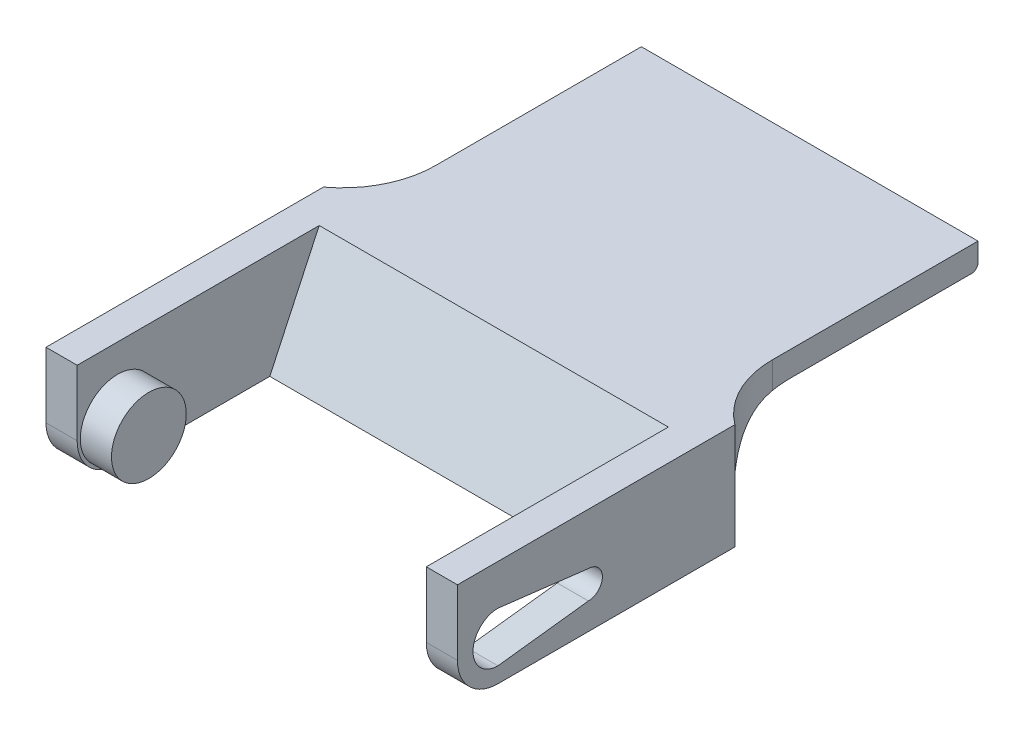
ISO-10303-21;
HEADER;
FILE_DESCRIPTION(('STEP AP214'),'2;1');
FILE_NAME('part.step','',(''),(''),'','','');
FILE_SCHEMA(('AUTOMOTIVE_DESIGN { 1 0 10303 214 1 1 1 1 }'));
ENDSEC;
DATA;
#1=APPLICATION_CONTEXT('core data for automotive mechanical design processes');
#2=APPLICATION_PROTOCOL_DEFINITION('international standard','automotive_design',2000,#1);
#3=PRODUCT_CONTEXT('',#1,'mechanical');
#4=PRODUCT('Part','Part','',(#3));
#5=PRODUCT_RELATED_PRODUCT_CATEGORY('part','',(#4));
#6=PRODUCT_DEFINITION_FORMATION('','',#4);
#7=PRODUCT_DEFINITION_CONTEXT('part definition',#1,'design');
#8=PRODUCT_DEFINITION('design','',#6,#7);
#9=PRODUCT_DEFINITION_SHAPE('','',#8);
#10=(LENGTH_UNIT() NAMED_UNIT(*) SI_UNIT(.MILLI.,.METRE.));
#11=(NAMED_UNIT(*) PLANE_ANGLE_UNIT() SI_UNIT($,.RADIAN.));
#12=(NAMED_UNIT(*) SI_UNIT($,.STERADIAN.) SOLID_ANGLE_UNIT());
#13=UNCERTAINTY_MEASURE_WITH_UNIT(LENGTH_MEASURE(1.E-05),#10,'distance_accuracy_value','');
#14=(GEOMETRIC_REPRESENTATION_CONTEXT(3) GLOBAL_UNCERTAINTY_ASSIGNED_CONTEXT((#13)) GLOBAL_UNIT_ASSIGNED_CONTEXT((#10,
#11,#12)) REPRESENTATION_CONTEXT('',''));
#15=CARTESIAN_POINT('',(0.,0.,0.));
#16=DIRECTION('',(0.,0.,1.));
#17=DIRECTION('',(1.,0.,0.));
#18=AXIS2_PLACEMENT_3D('',#15,#16,#17);
#19=CARTESIAN_POINT('',(-3.,-6.50000000000001,23.));
#20=DIRECTION('',(1.,0.,0.));
#21=DIRECTION('',(0.,0.,-1.));
#22=AXIS2_PLACEMENT_3D('',#19,#20,#21);
#23=CYLINDRICAL_SURFACE('',#22,6.);
#24=CARTESIAN_POINT('',(-1.,-6.50000000000001,23.));
#25=DIRECTION('',(-1.,0.,0.));
#26=DIRECTION('',(0.,0.,1.));
#27=AXIS2_PLACEMENT_3D('',#24,#25,#26);
#28=CIRCLE('',#27,6.);
#29=CARTESIAN_POINT('',(-1.,-6.50000000000001,29.));
#30=VERTEX_POINT('',#29);
#31=EDGE_CURVE('E383',#30,#30,#28,.T.);
#32=ORIENTED_EDGE('',*,*,#31,.F.);
#33=EDGE_LOOP('',(#32));
#34=FACE_BOUND('',#33,.T.);
#35=CARTESIAN_POINT('',(4.,-6.50000000000001,23.));
#36=DIRECTION('',(1.,0.,0.));
#37=DIRECTION('',(0.,0.,-1.));
#38=AXIS2_PLACEMENT_3D('',#35,#36,#37);
#39=CIRCLE('',#38,6.);
#40=CARTESIAN_POINT('',(4.,-6.50000000000001,17.));
#41=VERTEX_POINT('',#40);
#42=EDGE_CURVE('E387',#41,#41,#39,.T.);
#43=ORIENTED_EDGE('',*,*,#42,.F.);
#44=EDGE_LOOP('',(#43));
#45=FACE_BOUND('',#44,.T.);
#46=ADVANCED_FACE('F39',(#34,#45),#23,.T.);
#47=CARTESIAN_POINT('',(-6.,0.,0.));
#48=DIRECTION('',(1.,0.,0.));
#49=DIRECTION('',(0.,0.,-1.));
#50=AXIS2_PLACEMENT_3D('',#47,#48,#49);
#51=PLANE('',#50);
#52=DIRECTION('',(0.,0.,-1.));
#53=VECTOR('',#52,1.);
#54=CARTESIAN_POINT('',(-6.,-13.,0.));
#55=LINE('',#54,#53);
#56=CARTESIAN_POINT('',(-6.,-13.,23.));
#57=VERTEX_POINT('',#56);
#58=CARTESIAN_POINT('',(-6.,-13.,-15.));
#59=VERTEX_POINT('',#58);
#60=EDGE_CURVE('E189',#57,#59,#55,.T.);
#61=ORIENTED_EDGE('',*,*,#60,.F.);
#62=CARTESIAN_POINT('',(-6.,-6.50000000000001,23.));
#63=DIRECTION('',(1.,0.,0.));
#64=DIRECTION('',(0.,0.,1.));
#65=AXIS2_PLACEMENT_3D('',#62,#63,#64);
#66=CIRCLE('',#65,6.5);
#67=CARTESIAN_POINT('',(-6.,-6.50000000000001,29.5));
#68=VERTEX_POINT('',#67);
#69=EDGE_CURVE('E386',#68,#57,#66,.T.);
#70=ORIENTED_EDGE('',*,*,#69,.F.);
#71=DIRECTION('',(0.,-1.,0.));
#72=VECTOR('',#71,1.);
#73=CARTESIAN_POINT('',(-6.,-6.50000000000001,29.5));
#74=LINE('',#73,#72);
#75=CARTESIAN_POINT('',(-6.,4.,29.5));
#76=VERTEX_POINT('',#75);
#77=EDGE_CURVE('E416',#76,#68,#74,.T.);
#78=ORIENTED_EDGE('',*,*,#77,.F.);
#79=DIRECTION('',(0.,0.,1.));
#80=VECTOR('',#79,1.);
#81=CARTESIAN_POINT('',(-6.,4.,0.));
#82=LINE('',#81,#80);
#83=CARTESIAN_POINT('',(-6.,4.,-15.));
#84=VERTEX_POINT('',#83);
#85=EDGE_CURVE('E352',#84,#76,#82,.T.);
#86=ORIENTED_EDGE('',*,*,#85,.F.);
#87=DIRECTION('',(0.,1.,0.));
#88=VECTOR('',#87,1.);
#89=CARTESIAN_POINT('',(-6.,-13.,-15.));
#90=LINE('',#89,#88);
#91=EDGE_CURVE('E199',#59,#84,#90,.T.);
#92=ORIENTED_EDGE('',*,*,#91,.F.);
#93=EDGE_LOOP('',(#61,#70,#78,#86,#92));
#94=FACE_BOUND('',#93,.T.);
#95=ADVANCED_FACE('F228',(#94),#51,.F.);
#96=CARTESIAN_POINT('',(60.,0.,0.));
#97=DIRECTION('',(1.,0.,0.));
#98=DIRECTION('',(0.,0.,-1.));
#99=AXIS2_PLACEMENT_3D('',#96,#97,#98);
#100=PLANE('',#99);
#101=CARTESIAN_POINT('',(60.,-6.50000000000001,23.));
#102=DIRECTION('',(1.,0.,0.));
#103=DIRECTION('',(0.,0.,1.));
#104=AXIS2_PLACEMENT_3D('',#101,#102,#103);
#105=CIRCLE('',#104,6.5);
#106=CARTESIAN_POINT('',(60.,-6.50000000000001,29.5));
#107=VERTEX_POINT('',#106);
#108=CARTESIAN_POINT('',(60.,-13.,23.));
#109=VERTEX_POINT('',#108);
#110=EDGE_CURVE('E422',#107,#109,#105,.T.);
#111=ORIENTED_EDGE('',*,*,#110,.T.);
#112=DIRECTION('',(0.,0.,-1.));
#113=VECTOR('',#112,1.);
#114=CARTESIAN_POINT('',(60.,-13.,0.));
#115=LINE('',#114,#113);
#116=CARTESIAN_POINT('',(60.,-13.,-15.));
#117=VERTEX_POINT('',#116);
#118=EDGE_CURVE('E190',#109,#117,#115,.T.);
#119=ORIENTED_EDGE('',*,*,#118,.T.);
#120=DIRECTION('',(0.,1.,0.));
#121=VECTOR('',#120,1.);
#122=CARTESIAN_POINT('',(60.,-13.,-15.));
#123=LINE('',#122,#121);
#124=CARTESIAN_POINT('',(60.,4.,-15.));
#125=VERTEX_POINT('',#124);
#126=EDGE_CURVE('E193',#117,#125,#123,.T.);
#127=ORIENTED_EDGE('',*,*,#126,.T.);
#128=DIRECTION('',(0.,0.,1.));
#129=VECTOR('',#128,1.);
#130=CARTESIAN_POINT('',(60.,4.,0.));
#131=LINE('',#130,#129);
#132=CARTESIAN_POINT('',(60.,4.,29.5));
#133=VERTEX_POINT('',#132);
#134=EDGE_CURVE('E178',#125,#133,#131,.T.);
#135=ORIENTED_EDGE('',*,*,#134,.T.);
#136=DIRECTION('',(0.,-1.,0.));
#137=VECTOR('',#136,1.);
#138=CARTESIAN_POINT('',(60.,-6.50000000000001,29.5));
#139=LINE('',#138,#137);
#140=EDGE_CURVE('E424',#133,#107,#139,.T.);
#141=ORIENTED_EDGE('',*,*,#140,.T.);
#142=EDGE_LOOP('',(#111,#119,#127,#135,#141));
#143=FACE_BOUND('',#142,.T.);
#144=CARTESIAN_POINT('',(60.,-6.50000000000001,23.));
#145=DIRECTION('',(1.,0.,0.));
#146=DIRECTION('',(0.,0.,-1.));
#147=AXIS2_PLACEMENT_3D('',#144,#145,#146);
#148=CIRCLE('',#147,4.);
#149=CARTESIAN_POINT('',(60.,-2.50000000000001,23.));
#150=VERTEX_POINT('',#149);
#151=CARTESIAN_POINT('',(60.,-10.5,23.));
#152=VERTEX_POINT('',#151);
#153=EDGE_CURVE('E447',#150,#152,#148,.T.);
#154=ORIENTED_EDGE('',*,*,#153,.F.);
#155=DIRECTION('',(0.,-0.119820160190858,-0.992795613009967));
#156=VECTOR('',#155,1.);
#157=CARTESIAN_POINT('',(60.,-5.20011719894522,0.627600351596837));
#158=LINE('',#157,#156);
#159=CARTESIAN_POINT('',(60.,-4.25000000000001,8.5));
#160=VERTEX_POINT('',#159);
#161=EDGE_CURVE('E444',#150,#160,#158,.T.);
#162=ORIENTED_EDGE('',*,*,#161,.T.);
#163=CARTESIAN_POINT('',(60.,-6.50000000000001,8.5));
#164=DIRECTION('',(1.,0.,0.));
#165=DIRECTION('',(0.,0.,-1.));
#166=AXIS2_PLACEMENT_3D('',#163,#164,#165);
#167=CIRCLE('',#166,2.25);
#168=CARTESIAN_POINT('',(60.,-8.75000000000001,8.5));
#169=VERTEX_POINT('',#168);
#170=EDGE_CURVE('E453',#169,#160,#167,.T.);
#171=ORIENTED_EDGE('',*,*,#170,.F.);
#172=DIRECTION('',(0.,-0.119820160190858,0.992795613009968));
#173=VECTOR('',#172,1.);
#174=CARTESIAN_POINT('',(60.,-7.61324348080868,-0.918839730442426));
#175=LINE('',#174,#173);
#176=EDGE_CURVE('E450',#169,#152,#175,.T.);
#177=ORIENTED_EDGE('',*,*,#176,.T.);
#178=EDGE_LOOP('',(#154,#162,#171,#177));
#179=FACE_BOUND('',#178,.T.);
#180=ADVANCED_FACE('F195',(#143,#179),#100,.T.);
#181=CARTESIAN_POINT('',(-1.00000000000001,-13.,0.));
#182=DIRECTION('',(-1.,0.,0.));
#183=DIRECTION('',(0.,0.,1.));
#184=AXIS2_PLACEMENT_3D('',#181,#182,#183);
#185=PLANE('',#184);
#186=ORIENTED_EDGE('',*,*,#31,.T.);
#187=EDGE_LOOP('',(#186));
#188=FACE_BOUND('',#187,.T.);
#189=DIRECTION('',(0.,-1.,0.));
#190=VECTOR('',#189,1.);
#191=CARTESIAN_POINT('',(-1.,-13.,29.5));
#192=LINE('',#191,#190);
#193=CARTESIAN_POINT('',(-1.00000000000001,4.,29.5));
#194=VERTEX_POINT('',#193);
#195=CARTESIAN_POINT('',(-1.,-6.50000000000001,29.5));
#196=VERTEX_POINT('',#195);
#197=EDGE_CURVE('E442',#194,#196,#192,.T.);
#198=ORIENTED_EDGE('',*,*,#197,.T.);
#199=CARTESIAN_POINT('',(-1.00000000000001,-6.50000000000001,23.));
#200=DIRECTION('',(-1.,0.,0.));
#201=DIRECTION('',(0.,0.,1.));
#202=AXIS2_PLACEMENT_3D('',#199,#200,#201);
#203=CIRCLE('',#202,6.5);
#204=CARTESIAN_POINT('',(-1.,-13.,23.));
#205=VERTEX_POINT('',#204);
#206=EDGE_CURVE('E437',#196,#205,#203,.F.);
#207=ORIENTED_EDGE('',*,*,#206,.T.);
#208=DIRECTION('',(0.,0.,1.));
#209=VECTOR('',#208,1.);
#210=CARTESIAN_POINT('',(-1.00000000000001,-13.,0.));
#211=LINE('',#210,#209);
#212=CARTESIAN_POINT('',(-1.00000000000001,-13.,-1.39892297446505));
#213=VERTEX_POINT('',#212);
#214=EDGE_CURVE('E390',#213,#205,#211,.T.);
#215=ORIENTED_EDGE('',*,*,#214,.F.);
#216=DIRECTION('',(0.,-0.906307787036647,0.422618261740705));
#217=VECTOR('',#216,1.);
#218=CARTESIAN_POINT('',(-1.00000000000001,-13.5358185854702,-1.14906666467851));
#219=LINE('',#218,#217);
#220=CARTESIAN_POINT('',(-1.00000000000001,4.,-9.32615316310017));
#221=VERTEX_POINT('',#220);
#222=EDGE_CURVE('E311',#213,#221,#219,.F.);
#223=ORIENTED_EDGE('',*,*,#222,.T.);
#224=DIRECTION('',(0.,0.,-1.));
#225=VECTOR('',#224,1.);
#226=CARTESIAN_POINT('',(-1.00000000000001,4.,28.));
#227=LINE('',#226,#225);
#228=EDGE_CURVE('E401',#194,#221,#227,.T.);
#229=ORIENTED_EDGE('',*,*,#228,.F.);
#230=EDGE_LOOP('',(#198,#207,#215,#223,#229));
#231=FACE_BOUND('',#230,.T.);
#232=ADVANCED_FACE('F273',(#188,#231),#185,.F.);
#233=CARTESIAN_POINT('',(55.,-13.,0.));
#234=DIRECTION('',(1.,0.,0.));
#235=DIRECTION('',(0.,0.,-1.));
#236=AXIS2_PLACEMENT_3D('',#233,#234,#235);
#237=PLANE('',#236);
#238=DIRECTION('',(0.,0.,-1.));
#239=VECTOR('',#238,1.);
#240=CARTESIAN_POINT('',(55.,-13.,0.));
#241=LINE('',#240,#239);
#242=CARTESIAN_POINT('',(55.,-13.,23.));
#243=VERTEX_POINT('',#242);
#244=CARTESIAN_POINT('',(55.,-13.,-1.39892297446505));
#245=VERTEX_POINT('',#244);
#246=EDGE_CURVE('E393',#243,#245,#241,.T.);
#247=ORIENTED_EDGE('',*,*,#246,.F.);
#248=CARTESIAN_POINT('',(55.,-6.50000000000001,23.));
#249=DIRECTION('',(1.,0.,0.));
#250=DIRECTION('',(0.,0.,-1.));
#251=AXIS2_PLACEMENT_3D('',#248,#249,#250);
#252=CIRCLE('',#251,6.5);
#253=CARTESIAN_POINT('',(55.,-6.50000000000001,29.5));
#254=VERTEX_POINT('',#253);
#255=EDGE_CURVE('E432',#243,#254,#252,.F.);
#256=ORIENTED_EDGE('',*,*,#255,.T.);
#257=DIRECTION('',(0.,1.,0.));
#258=VECTOR('',#257,1.);
#259=CARTESIAN_POINT('',(55.,-13.,29.5));
#260=LINE('',#259,#258);
#261=CARTESIAN_POINT('',(55.,4.,29.5));
#262=VERTEX_POINT('',#261);
#263=EDGE_CURVE('E440',#254,#262,#260,.T.);
#264=ORIENTED_EDGE('',*,*,#263,.T.);
#265=DIRECTION('',(0.,0.,1.));
#266=VECTOR('',#265,1.);
#267=CARTESIAN_POINT('',(55.,4.,0.));
#268=LINE('',#267,#266);
#269=CARTESIAN_POINT('',(55.,4.,-9.32615316310017));
#270=VERTEX_POINT('',#269);
#271=EDGE_CURVE('E399',#270,#262,#268,.T.);
#272=ORIENTED_EDGE('',*,*,#271,.F.);
#273=DIRECTION('',(0.,0.906307787036647,-0.422618261740705));
#274=VECTOR('',#273,1.);
#275=CARTESIAN_POINT('',(55.,-13.5358185854702,-1.14906666467851));
#276=LINE('',#275,#274);
#277=EDGE_CURVE('E320',#270,#245,#276,.F.);
#278=ORIENTED_EDGE('',*,*,#277,.T.);
#279=EDGE_LOOP('',(#247,#256,#264,#272,#278));
#280=FACE_BOUND('',#279,.T.);
#281=DIRECTION('',(0.,-0.119820160190858,-0.992795613009967));
#282=VECTOR('',#281,1.);
#283=CARTESIAN_POINT('',(55.,-5.38675651919134,-0.918839730442428));
#284=LINE('',#283,#282);
#285=CARTESIAN_POINT('',(55.,-2.50000000000001,23.));
#286=VERTEX_POINT('',#285);
#287=CARTESIAN_POINT('',(55.,-4.25000000000001,8.5));
#288=VERTEX_POINT('',#287);
#289=EDGE_CURVE('E371',#286,#288,#284,.T.);
#290=ORIENTED_EDGE('',*,*,#289,.F.);
#291=CARTESIAN_POINT('',(55.,-6.50000000000001,23.));
#292=DIRECTION('',(1.,0.,0.));
#293=DIRECTION('',(0.,0.,-1.));
#294=AXIS2_PLACEMENT_3D('',#291,#292,#293);
#295=CIRCLE('',#294,4.);
#296=CARTESIAN_POINT('',(55.,-10.5,23.));
#297=VERTEX_POINT('',#296);
#298=EDGE_CURVE('E362',#286,#297,#295,.T.);
#299=ORIENTED_EDGE('',*,*,#298,.T.);
#300=DIRECTION('',(0.,-0.119820160190858,0.992795613009968));
#301=VECTOR('',#300,1.);
#302=CARTESIAN_POINT('',(55.,-7.7998828010548,0.627600351596832));
#303=LINE('',#302,#301);
#304=CARTESIAN_POINT('',(55.,-8.75000000000001,8.5));
#305=VERTEX_POINT('',#304);
#306=EDGE_CURVE('E365',#305,#297,#303,.T.);
#307=ORIENTED_EDGE('',*,*,#306,.F.);
#308=CARTESIAN_POINT('',(55.,-6.50000000000001,8.5));
#309=DIRECTION('',(1.,0.,0.));
#310=DIRECTION('',(0.,0.,-1.));
#311=AXIS2_PLACEMENT_3D('',#308,#309,#310);
#312=CIRCLE('',#311,2.25);
#313=EDGE_CURVE('E368',#305,#288,#312,.T.);
#314=ORIENTED_EDGE('',*,*,#313,.T.);
#315=EDGE_LOOP('',(#290,#299,#307,#314));
#316=FACE_BOUND('',#315,.T.);
#317=ADVANCED_FACE('F269',(#280,#316),#237,.F.);
#318=CARTESIAN_POINT('',(0.,4.,0.));
#319=DIRECTION('',(1.,0.,0.));
#320=DIRECTION('',(0.,0.,-1.));
#321=AXIS2_PLACEMENT_3D('',#318,#319,#320);
#322=PLANE('',#321);
#323=CARTESIAN_POINT('',(0.,-15.,-29.8660687473185));
#324=DIRECTION('',(1.,0.,0.));
#325=DIRECTION('',(0.,0.,-1.));
#326=AXIS2_PLACEMENT_3D('',#323,#324,#325);
#327=CIRCLE('',#326,15.);
#328=CARTESIAN_POINT('',(0.,0.,-29.8660687473185));
#329=VERTEX_POINT('',#328);
#330=CARTESIAN_POINT('',(0.,-0.276357450153711,-27.));
#331=VERTEX_POINT('',#330);
#332=EDGE_CURVE('E329',#329,#331,#327,.T.);
#333=ORIENTED_EDGE('',*,*,#332,.T.);
#334=DIRECTION('',(0.,-1.,0.));
#335=VECTOR('',#334,1.);
#336=CARTESIAN_POINT('',(0.,4.,-27.));
#337=LINE('',#336,#335);
#338=CARTESIAN_POINT('',(0.,4.,-27.));
#339=VERTEX_POINT('',#338);
#340=EDGE_CURVE('E207',#331,#339,#337,.F.);
#341=ORIENTED_EDGE('',*,*,#340,.T.);
#342=DIRECTION('',(0.,0.,1.));
#343=VECTOR('',#342,1.);
#344=CARTESIAN_POINT('',(0.,4.,0.));
#345=LINE('',#344,#343);
#346=CARTESIAN_POINT('',(0.,4.,-60.));
#347=VERTEX_POINT('',#346);
#348=EDGE_CURVE('E336',#347,#339,#345,.T.);
#349=ORIENTED_EDGE('',*,*,#348,.F.);
#350=DIRECTION('',(0.,-1.,0.));
#351=VECTOR('',#350,1.);
#352=CARTESIAN_POINT('',(0.,4.,-60.));
#353=LINE('',#352,#351);
#354=CARTESIAN_POINT('',(0.,1.,-60.));
#355=VERTEX_POINT('',#354);
#356=EDGE_CURVE('E356',#347,#355,#353,.T.);
#357=ORIENTED_EDGE('',*,*,#356,.T.);
#358=CARTESIAN_POINT('',(0.,1.,-59.));
#359=DIRECTION('',(1.,0.,0.));
#360=DIRECTION('',(0.,0.,-1.));
#361=AXIS2_PLACEMENT_3D('',#358,#359,#360);
#362=CIRCLE('',#361,1.);
#363=CARTESIAN_POINT('',(0.,0.,-59.));
#364=VERTEX_POINT('',#363);
#365=EDGE_CURVE('E376',#355,#364,#362,.F.);
#366=ORIENTED_EDGE('',*,*,#365,.T.);
#367=DIRECTION('',(0.,0.,1.));
#368=VECTOR('',#367,1.);
#369=CARTESIAN_POINT('',(0.,0.,0.));
#370=LINE('',#369,#368);
#371=EDGE_CURVE('E349',#364,#329,#370,.T.);
#372=ORIENTED_EDGE('',*,*,#371,.T.);
#373=EDGE_LOOP('',(#333,#341,#349,#357,#366,#372));
#374=FACE_BOUND('',#373,.T.);
#375=ADVANCED_FACE('F272',(#374),#322,.F.);
#376=CARTESIAN_POINT('',(54.,4.,0.));
#377=DIRECTION('',(-1.,0.,0.));
#378=DIRECTION('',(0.,0.,1.));
#379=AXIS2_PLACEMENT_3D('',#376,#377,#378);
#380=PLANE('',#379);
#381=DIRECTION('',(0.,0.,-1.));
#382=VECTOR('',#381,1.);
#383=CARTESIAN_POINT('',(54.,4.,0.));
#384=LINE('',#383,#382);
#385=CARTESIAN_POINT('',(54.,4.,-27.));
#386=VERTEX_POINT('',#385);
#387=CARTESIAN_POINT('',(54.,4.,-60.));
#388=VERTEX_POINT('',#387);
#389=EDGE_CURVE('E345',#386,#388,#384,.T.);
#390=ORIENTED_EDGE('',*,*,#389,.F.);
#391=DIRECTION('',(0.,-1.,0.));
#392=VECTOR('',#391,1.);
#393=CARTESIAN_POINT('',(54.,4.,-27.));
#394=LINE('',#393,#392);
#395=CARTESIAN_POINT('',(54.,-0.276357450153711,-27.));
#396=VERTEX_POINT('',#395);
#397=EDGE_CURVE('E204',#386,#396,#394,.T.);
#398=ORIENTED_EDGE('',*,*,#397,.T.);
#399=CARTESIAN_POINT('',(54.,-15.,-29.8660687473185));
#400=DIRECTION('',(-1.,0.,0.));
#401=DIRECTION('',(0.,0.,1.));
#402=AXIS2_PLACEMENT_3D('',#399,#400,#401);
#403=CIRCLE('',#402,15.);
#404=CARTESIAN_POINT('',(54.,0.,-29.8660687473185));
#405=VERTEX_POINT('',#404);
#406=EDGE_CURVE('E322',#396,#405,#403,.T.);
#407=ORIENTED_EDGE('',*,*,#406,.T.);
#408=DIRECTION('',(0.,0.,-1.));
#409=VECTOR('',#408,1.);
#410=CARTESIAN_POINT('',(54.,0.,0.));
#411=LINE('',#410,#409);
#412=CARTESIAN_POINT('',(54.,0.,-59.));
#413=VERTEX_POINT('',#412);
#414=EDGE_CURVE('E346',#405,#413,#411,.T.);
#415=ORIENTED_EDGE('',*,*,#414,.T.);
#416=CARTESIAN_POINT('',(54.,1.,-59.));
#417=DIRECTION('',(-1.,0.,0.));
#418=DIRECTION('',(0.,0.,1.));
#419=AXIS2_PLACEMENT_3D('',#416,#417,#418);
#420=CIRCLE('',#419,1.);
#421=CARTESIAN_POINT('',(54.,1.,-60.));
#422=VERTEX_POINT('',#421);
#423=EDGE_CURVE('E381',#413,#422,#420,.F.);
#424=ORIENTED_EDGE('',*,*,#423,.T.);
#425=DIRECTION('',(0.,-1.,0.));
#426=VECTOR('',#425,1.);
#427=CARTESIAN_POINT('',(54.,4.,-60.));
#428=LINE('',#427,#426);
#429=EDGE_CURVE('E359',#388,#422,#428,.T.);
#430=ORIENTED_EDGE('',*,*,#429,.F.);
#431=EDGE_LOOP('',(#390,#398,#407,#415,#424,#430));
#432=FACE_BOUND('',#431,.T.);
#433=ADVANCED_FACE('F291',(#432),#380,.F.);
#434=CARTESIAN_POINT('',(0.,4.,-60.));
#435=DIRECTION('',(0.,0.,1.));
#436=DIRECTION('',(1.,0.,0.));
#437=AXIS2_PLACEMENT_3D('',#434,#435,#436);
#438=PLANE('',#437);
#439=ORIENTED_EDGE('',*,*,#429,.T.);
#440=DIRECTION('',(-1.,0.,0.));
#441=VECTOR('',#440,1.);
#442=CARTESIAN_POINT('',(0.,1.,-60.));
#443=LINE('',#442,#441);
#444=EDGE_CURVE('E373',#422,#355,#443,.T.);
#445=ORIENTED_EDGE('',*,*,#444,.T.);
#446=ORIENTED_EDGE('',*,*,#356,.F.);
#447=DIRECTION('',(-1.,0.,0.));
#448=VECTOR('',#447,1.);
#449=CARTESIAN_POINT('',(0.,4.,-60.));
#450=LINE('',#449,#448);
#451=EDGE_CURVE('E343',#388,#347,#450,.T.);
#452=ORIENTED_EDGE('',*,*,#451,.F.);
#453=EDGE_LOOP('',(#439,#445,#446,#452));
#454=FACE_BOUND('',#453,.T.);
#455=ADVANCED_FACE('F285',(#454),#438,.F.);
#456=CARTESIAN_POINT('',(0.,4.,0.));
#457=DIRECTION('',(0.,-1.,0.));
#458=DIRECTION('',(0.,0.,-1.));
#459=AXIS2_PLACEMENT_3D('',#456,#457,#458);
#460=PLANE('',#459);
#461=ORIENTED_EDGE('',*,*,#348,.T.);
#462=CARTESIAN_POINT('',(-15.,4.,-27.));
#463=DIRECTION('',(0.,-1.,0.));
#464=DIRECTION('',(0.,0.,-1.));
#465=AXIS2_PLACEMENT_3D('',#462,#463,#464);
#466=CIRCLE('',#465,15.);
#467=EDGE_CURVE('E54',#339,#84,#466,.T.);
#468=ORIENTED_EDGE('',*,*,#467,.T.);
#469=ORIENTED_EDGE('',*,*,#85,.T.);
#470=DIRECTION('',(-1.,0.,0.));
#471=VECTOR('',#470,1.);
#472=CARTESIAN_POINT('',(60.,4.,29.5));
#473=LINE('',#472,#471);
#474=EDGE_CURVE('E402',#194,#76,#473,.T.);
#475=ORIENTED_EDGE('',*,*,#474,.F.);
#476=ORIENTED_EDGE('',*,*,#228,.T.);
#477=DIRECTION('',(1.,0.,0.));
#478=VECTOR('',#477,1.);
#479=CARTESIAN_POINT('',(0.,4.,-9.32615316310017));
#480=LINE('',#479,#478);
#481=EDGE_CURVE('E316',#221,#270,#480,.T.);
#482=ORIENTED_EDGE('',*,*,#481,.T.);
#483=ORIENTED_EDGE('',*,*,#271,.T.);
#484=EDGE_CURVE('E186',#133,#262,#473,.T.);
#485=ORIENTED_EDGE('',*,*,#484,.F.);
#486=ORIENTED_EDGE('',*,*,#134,.F.);
#487=CARTESIAN_POINT('',(69.,4.,-27.));
#488=DIRECTION('',(0.,-1.,0.));
#489=DIRECTION('',(0.,0.,-1.));
#490=AXIS2_PLACEMENT_3D('',#487,#488,#489);
#491=CIRCLE('',#490,15.);
#492=EDGE_CURVE('E183',#125,#386,#491,.T.);
#493=ORIENTED_EDGE('',*,*,#492,.T.);
#494=ORIENTED_EDGE('',*,*,#389,.T.);
#495=ORIENTED_EDGE('',*,*,#451,.T.);
#496=EDGE_LOOP('',(#461,#468,#469,#475,#476,#482,#483,#485,#486,#493,#494,#495));
#497=FACE_BOUND('',#496,.T.);
#498=ADVANCED_FACE('F181',(#497),#460,.F.);
#499=CARTESIAN_POINT('',(0.,0.,0.));
#500=DIRECTION('',(0.,-1.,0.));
#501=DIRECTION('',(0.,0.,-1.));
#502=AXIS2_PLACEMENT_3D('',#499,#500,#501);
#503=PLANE('',#502);
#504=ORIENTED_EDGE('',*,*,#414,.F.);
#505=DIRECTION('',(1.,0.,0.));
#506=VECTOR('',#505,1.);
#507=CARTESIAN_POINT('',(0.,0.,-29.8660687473185));
#508=LINE('',#507,#506);
#509=EDGE_CURVE('E319',#405,#329,#508,.F.);
#510=ORIENTED_EDGE('',*,*,#509,.T.);
#511=ORIENTED_EDGE('',*,*,#371,.F.);
#512=DIRECTION('',(-1.,0.,0.));
#513=VECTOR('',#512,1.);
#514=CARTESIAN_POINT('',(54.,0.,-59.));
#515=LINE('',#514,#513);
#516=EDGE_CURVE('E378',#364,#413,#515,.F.);
#517=ORIENTED_EDGE('',*,*,#516,.T.);
#518=EDGE_LOOP('',(#504,#510,#511,#517));
#519=FACE_BOUND('',#518,.T.);
#520=ADVANCED_FACE('F282',(#519),#503,.T.);
#521=CARTESIAN_POINT('',(-6.,-13.,0.));
#522=DIRECTION('',(0.,-1.,0.));
#523=DIRECTION('',(0.,0.,-1.));
#524=AXIS2_PLACEMENT_3D('',#521,#522,#523);
#525=PLANE('',#524);
#526=ORIENTED_EDGE('',*,*,#246,.T.);
#527=DIRECTION('',(1.,0.,0.));
#528=VECTOR('',#527,1.);
#529=CARTESIAN_POINT('',(-6.,-13.,-1.39892297446505));
#530=LINE('',#529,#528);
#531=EDGE_CURVE('E314',#245,#213,#530,.F.);
#532=ORIENTED_EDGE('',*,*,#531,.T.);
#533=ORIENTED_EDGE('',*,*,#214,.T.);
#534=DIRECTION('',(-1.,0.,0.));
#535=VECTOR('',#534,1.);
#536=CARTESIAN_POINT('',(60.,-13.,23.));
#537=LINE('',#536,#535);
#538=EDGE_CURVE('E426',#205,#57,#537,.T.);
#539=ORIENTED_EDGE('',*,*,#538,.T.);
#540=ORIENTED_EDGE('',*,*,#60,.T.);
#541=DIRECTION('',(-1.,0.,0.));
#542=VECTOR('',#541,1.);
#543=CARTESIAN_POINT('',(-6.,-13.,-15.));
#544=LINE('',#543,#542);
#545=EDGE_CURVE('E61',#117,#59,#544,.T.);
#546=ORIENTED_EDGE('',*,*,#545,.F.);
#547=ORIENTED_EDGE('',*,*,#118,.F.);
#548=EDGE_CURVE('E394',#109,#243,#537,.T.);
#549=ORIENTED_EDGE('',*,*,#548,.T.);
#550=EDGE_LOOP('',(#526,#532,#533,#539,#540,#546,#547,#549));
#551=FACE_BOUND('',#550,.T.);
#552=ADVANCED_FACE('F264',(#551),#525,.T.);
#553=CARTESIAN_POINT('',(-6.00000000000001,-6.50000000000001,23.));
#554=DIRECTION('',(1.,0.,0.));
#555=DIRECTION('',(0.,0.,-1.));
#556=AXIS2_PLACEMENT_3D('',#553,#554,#555);
#557=CYLINDRICAL_SURFACE('',#556,4.);
#558=DIRECTION('',(1.,0.,0.));
#559=VECTOR('',#558,1.);
#560=CARTESIAN_POINT('',(-6.00000000000001,-2.50000000000001,23.));
#561=LINE('',#560,#559);
#562=EDGE_CURVE('E456',#286,#150,#561,.T.);
#563=ORIENTED_EDGE('',*,*,#562,.T.);
#564=ORIENTED_EDGE('',*,*,#153,.T.);
#565=DIRECTION('',(1.,0.,0.));
#566=VECTOR('',#565,1.);
#567=CARTESIAN_POINT('',(-6.00000000000001,-10.5,23.));
#568=LINE('',#567,#566);
#569=EDGE_CURVE('E460',#297,#152,#568,.T.);
#570=ORIENTED_EDGE('',*,*,#569,.F.);
#571=ORIENTED_EDGE('',*,*,#298,.F.);
#572=EDGE_LOOP('',(#563,#564,#570,#571));
#573=FACE_BOUND('',#572,.T.);
#574=ADVANCED_FACE('F260',(#573),#557,.F.);
#575=CARTESIAN_POINT('',(-6.00000000000001,-7.61324348080868,-0.918839730442426));
#576=DIRECTION('',(0.,0.992795613009967,0.119820160190858));
#577=DIRECTION('',(0.,-0.119820160190858,0.992795613009968));
#578=AXIS2_PLACEMENT_3D('',#575,#576,#577);
#579=PLANE('',#578);
#580=ORIENTED_EDGE('',*,*,#306,.T.);
#581=ORIENTED_EDGE('',*,*,#569,.T.);
#582=ORIENTED_EDGE('',*,*,#176,.F.);
#583=DIRECTION('',(1.,0.,0.));
#584=VECTOR('',#583,1.);
#585=CARTESIAN_POINT('',(-6.00000000000001,-8.75000000000001,8.5));
#586=LINE('',#585,#584);
#587=EDGE_CURVE('E458',#305,#169,#586,.T.);
#588=ORIENTED_EDGE('',*,*,#587,.F.);
#589=EDGE_LOOP('',(#580,#581,#582,#588));
#590=FACE_BOUND('',#589,.T.);
#591=ADVANCED_FACE('F256',(#590),#579,.T.);
#592=CARTESIAN_POINT('',(-6.00000000000001,-6.50000000000001,8.5));
#593=DIRECTION('',(1.,0.,0.));
#594=DIRECTION('',(0.,0.,-1.));
#595=AXIS2_PLACEMENT_3D('',#592,#593,#594);
#596=CYLINDRICAL_SURFACE('',#595,2.25);
#597=ORIENTED_EDGE('',*,*,#587,.T.);
#598=ORIENTED_EDGE('',*,*,#170,.T.);
#599=DIRECTION('',(1.,0.,0.));
#600=VECTOR('',#599,1.);
#601=CARTESIAN_POINT('',(-6.00000000000001,-4.25000000000001,8.5));
#602=LINE('',#601,#600);
#603=EDGE_CURVE('E406',#288,#160,#602,.T.);
#604=ORIENTED_EDGE('',*,*,#603,.F.);
#605=ORIENTED_EDGE('',*,*,#313,.F.);
#606=EDGE_LOOP('',(#597,#598,#604,#605));
#607=FACE_BOUND('',#606,.T.);
#608=ADVANCED_FACE('F252',(#607),#596,.F.);
#609=CARTESIAN_POINT('',(-6.00000000000001,-5.20011719894522,0.627600351596837));
#610=DIRECTION('',(0.,-0.992795613009967,0.119820160190858));
#611=DIRECTION('',(0.,-0.119820160190858,-0.992795613009967));
#612=AXIS2_PLACEMENT_3D('',#609,#610,#611);
#613=PLANE('',#612);
#614=ORIENTED_EDGE('',*,*,#289,.T.);
#615=ORIENTED_EDGE('',*,*,#603,.T.);
#616=ORIENTED_EDGE('',*,*,#161,.F.);
#617=ORIENTED_EDGE('',*,*,#562,.F.);
#618=EDGE_LOOP('',(#614,#615,#616,#617));
#619=FACE_BOUND('',#618,.T.);
#620=ADVANCED_FACE('F255',(#619),#613,.T.);
#621=CARTESIAN_POINT('',(60.,-6.50000000000001,23.));
#622=DIRECTION('',(-1.,0.,0.));
#623=DIRECTION('',(0.,0.,1.));
#624=AXIS2_PLACEMENT_3D('',#621,#622,#623);
#625=CYLINDRICAL_SURFACE('',#624,6.5);
#626=ORIENTED_EDGE('',*,*,#548,.F.);
#627=ORIENTED_EDGE('',*,*,#110,.F.);
#628=DIRECTION('',(-1.,0.,0.));
#629=VECTOR('',#628,1.);
#630=CARTESIAN_POINT('',(60.,-6.50000000000001,29.5));
#631=LINE('',#630,#629);
#632=EDGE_CURVE('E429',#107,#254,#631,.T.);
#633=ORIENTED_EDGE('',*,*,#632,.T.);
#634=ORIENTED_EDGE('',*,*,#255,.F.);
#635=EDGE_LOOP('',(#626,#627,#633,#634));
#636=FACE_BOUND('',#635,.T.);
#637=ADVANCED_FACE('F251',(#636),#625,.T.);
#638=CARTESIAN_POINT('',(60.,-6.50000000000001,29.5));
#639=DIRECTION('',(0.,0.,-1.));
#640=DIRECTION('',(0.,1.,0.));
#641=AXIS2_PLACEMENT_3D('',#638,#639,#640);
#642=PLANE('',#641);
#643=ORIENTED_EDGE('',*,*,#632,.F.);
#644=ORIENTED_EDGE('',*,*,#140,.F.);
#645=ORIENTED_EDGE('',*,*,#484,.T.);
#646=ORIENTED_EDGE('',*,*,#263,.F.);
#647=EDGE_LOOP('',(#643,#644,#645,#646));
#648=FACE_BOUND('',#647,.T.);
#649=ADVANCED_FACE('F246',(#648),#642,.F.);
#650=ORIENTED_EDGE('',*,*,#474,.T.);
#651=ORIENTED_EDGE('',*,*,#77,.T.);
#652=EDGE_CURVE('E433',#196,#68,#631,.T.);
#653=ORIENTED_EDGE('',*,*,#652,.F.);
#654=ORIENTED_EDGE('',*,*,#197,.F.);
#655=EDGE_LOOP('',(#650,#651,#653,#654));
#656=FACE_BOUND('',#655,.T.);
#657=ADVANCED_FACE('F242',(#656),#642,.F.);
#658=ORIENTED_EDGE('',*,*,#652,.T.);
#659=ORIENTED_EDGE('',*,*,#69,.T.);
#660=ORIENTED_EDGE('',*,*,#538,.F.);
#661=ORIENTED_EDGE('',*,*,#206,.F.);
#662=EDGE_LOOP('',(#658,#659,#660,#661));
#663=FACE_BOUND('',#662,.T.);
#664=ADVANCED_FACE('F245',(#663),#625,.T.);
#665=CARTESIAN_POINT('',(0.,1.,-59.));
#666=DIRECTION('',(1.,0.,0.));
#667=DIRECTION('',(0.,0.,-1.));
#668=AXIS2_PLACEMENT_3D('',#665,#666,#667);
#669=CYLINDRICAL_SURFACE('',#668,1.);
#670=ORIENTED_EDGE('',*,*,#423,.F.);
#671=ORIENTED_EDGE('',*,*,#516,.F.);
#672=ORIENTED_EDGE('',*,*,#365,.F.);
#673=ORIENTED_EDGE('',*,*,#444,.F.);
#674=EDGE_LOOP('',(#670,#671,#672,#673));
#675=FACE_BOUND('',#674,.T.);
#676=ADVANCED_FACE('F249',(#675),#669,.T.);
#677=CARTESIAN_POINT('',(4.,-6.50000000000001,23.));
#678=DIRECTION('',(1.,0.,0.));
#679=DIRECTION('',(0.,0.,-1.));
#680=AXIS2_PLACEMENT_3D('',#677,#678,#679);
#681=PLANE('',#680);
#682=ORIENTED_EDGE('',*,*,#42,.T.);
#683=EDGE_LOOP('',(#682));
#684=FACE_BOUND('',#683,.T.);
#685=ADVANCED_FACE('F241',(#684),#681,.T.);
#686=CARTESIAN_POINT('',(0.,4.,-9.32615316310017));
#687=DIRECTION('',(0.,-0.422618261740705,-0.906307787036647));
#688=DIRECTION('',(1.,0.,0.));
#689=AXIS2_PLACEMENT_3D('',#686,#687,#688);
#690=PLANE('',#689);
#691=ORIENTED_EDGE('',*,*,#222,.F.);
#692=ORIENTED_EDGE('',*,*,#531,.F.);
#693=ORIENTED_EDGE('',*,*,#277,.F.);
#694=ORIENTED_EDGE('',*,*,#481,.F.);
#695=EDGE_LOOP('',(#691,#692,#693,#694));
#696=FACE_BOUND('',#695,.T.);
#697=ADVANCED_FACE('F225',(#696),#690,.F.);
#698=CARTESIAN_POINT('',(-6.,-15.,-29.8660687473185));
#699=DIRECTION('',(-1.,0.,0.));
#700=DIRECTION('',(0.,0.,1.));
#701=AXIS2_PLACEMENT_3D('',#698,#699,#700);
#702=CYLINDRICAL_SURFACE('',#701,15.);
#703=ORIENTED_EDGE('',*,*,#332,.F.);
#704=ORIENTED_EDGE('',*,*,#509,.F.);
#705=ORIENTED_EDGE('',*,*,#406,.F.);
#706=CARTESIAN_POINT('',(54.,-0.276357450153711,-27.));
#707=CARTESIAN_POINT('',(53.9999971554281,-0.310669706278479,-26.8237148063663));
#708=CARTESIAN_POINT('',(54.0031084480833,-0.348148222201478,-26.6480798047192));
#709=CARTESIAN_POINT('',(54.0153925826721,-0.42932548573282,-26.298487919295));
#710=CARTESIAN_POINT('',(54.0245647087597,-0.473023498277265,-26.1245308397998));
#711=CARTESIAN_POINT('',(54.0608882769933,-0.613156028736031,-25.6061824593751));
#712=CARTESIAN_POINT('',(54.096847890702,-0.718729230389492,-25.2648005527206));
#713=CARTESIAN_POINT('',(54.189976528416,-0.951596096183137,-24.5966964066634));
#714=CARTESIAN_POINT('',(54.2469196398527,-1.07865087416949,-24.2698581345664));
#715=CARTESIAN_POINT('',(54.3800126118451,-1.35369564189436,-23.6290853111988));
#716=CARTESIAN_POINT('',(54.4561676237318,-1.50169124186255,-23.3151542470647));
#717=CARTESIAN_POINT('',(54.6250418699314,-1.81615185375447,-22.7033949007167));
#718=CARTESIAN_POINT('',(54.7176797721545,-1.9825247230866,-22.4054965057486));
#719=CARTESIAN_POINT('',(54.9175045124994,-2.33268214779527,-21.8253055008481));
#720=CARTESIAN_POINT('',(55.0246902138559,-2.51646534239022,-21.5430116739975));
#721=CARTESIAN_POINT('',(55.2518043102573,-2.90067613194079,-20.9936883929055));
#722=CARTESIAN_POINT('',(55.3717784916612,-3.10116293046373,-20.7267194350732));
#723=CARTESIAN_POINT('',(55.621944014844,-3.51688977131113,-20.2095530739723));
#724=CARTESIAN_POINT('',(55.7521375212273,-3.73213293802398,-19.9593592448465));
#725=CARTESIAN_POINT('',(56.0745485740704,-4.26553669408298,-19.3787870014098));
#726=CARTESIAN_POINT('',(56.2706631925992,-4.5902911917835,-19.0565976324889));
#727=CARTESIAN_POINT('',(56.6728382765402,-5.26430432947201,-18.4457697675455));
#728=CARTESIAN_POINT('',(56.8789015782525,-5.61356997044273,-18.157140920286));
#729=CARTESIAN_POINT('',(57.2944698444683,-6.33455952208913,-17.6139871678538));
#730=CARTESIAN_POINT('',(57.5039680220777,-6.70624230590979,-17.3594024100273));
#731=CARTESIAN_POINT('',(57.9200773352212,-7.47224215867656,-16.883920946009));
#732=CARTESIAN_POINT('',(58.1266879949197,-7.86656290471035,-16.6630297340953));
#733=CARTESIAN_POINT('',(58.5047476238241,-8.62936801962336,-16.2802461859228));
#734=CARTESIAN_POINT('',(58.6774407385119,-8.99527423036077,-16.1144547915398));
#735=CARTESIAN_POINT('',(59.0072472517991,-9.74483311922192,-15.8109421969262));
#736=CARTESIAN_POINT('',(59.1643786374543,-10.128464538989,-15.6731883902989));
#737=CARTESIAN_POINT('',(59.4554993502596,-10.9161117868387,-15.4267925612108));
#738=CARTESIAN_POINT('',(59.5893735476169,-11.3202169107823,-15.3182939770777));
#739=CARTESIAN_POINT('',(59.8231287367413,-12.1469621646647,-15.133777695126));
#740=CARTESIAN_POINT('',(59.9228730957141,-12.5696693213611,-15.0578902472806));
#741=CARTESIAN_POINT('',(60.,-13.,-15.));
#742=B_SPLINE_CURVE_WITH_KNOTS('',3,(#706,#707,#708,#709,#710,#711,#712,#713,#714,#715,#716,
#717,#718,#719,#720,#721,#722,#723,#724,#725,#726,#727,#728,#729,#730,#731,#732,#733,#734,#735,
#736,#737,#738,#739,#740,#741),.UNSPECIFIED.,.F.,.F.,(4,2,2,2,2,2,2,2,2,2,2,2,2,2,2,2,2,4),(0.,
0.538661313629903,1.07725901725624,2.15289177410064,3.21726715605268,4.28192823531631,
5.34147468101328,6.40093838135226,7.4643314753916,8.52795042282292,10.0190643849971,
11.5106059929627,12.9994898552005,14.4886162450972,15.7990408743398,17.1079327223241,
18.4231299536083,19.7435323770274),.UNSPECIFIED.);
#743=EDGE_CURVE('E205',#396,#117,#742,.T.);
#744=ORIENTED_EDGE('',*,*,#743,.T.);
#745=ORIENTED_EDGE('',*,*,#545,.T.);
#746=CARTESIAN_POINT('',(-6.,-13.,-15.));
#747=CARTESIAN_POINT('',(-5.92730401020945,-12.5943274840733,-15.0545656701876));
#748=CARTESIAN_POINT('',(-5.83446839171832,-12.1953420127942,-15.125152989698));
#749=CARTESIAN_POINT('',(-5.61777230930261,-11.4137995770079,-15.295605622089));
#750=CARTESIAN_POINT('',(-5.49402430210371,-11.0311888272397,-15.3953650290256));
#751=CARTESIAN_POINT('',(-5.22480859069228,-10.284457042744,-15.6212366849142));
#752=CARTESIAN_POINT('',(-5.07945676622403,-9.92025046528974,-15.7472096883318));
#753=CARTESIAN_POINT('',(-4.77373744378527,-9.20764093184463,-16.0242902135718));
#754=CARTESIAN_POINT('',(-4.61335351241653,-8.85925590453614,-16.1754253866111));
#755=CARTESIAN_POINT('',(-4.2469511839492,-8.10236690682643,-16.5380547423181));
#756=CARTESIAN_POINT('',(-4.03873133430284,-7.69777867892018,-16.755493373311));
#757=CARTESIAN_POINT('',(-3.61788846272625,-6.9118933421684,-17.2251819354775));
#758=CARTESIAN_POINT('',(-3.40526572026328,-6.53059476107707,-17.4774296629155));
#759=CARTESIAN_POINT('',(-2.9822247467008,-5.79053800391573,-18.0171820765615));
#760=CARTESIAN_POINT('',(-2.77181416713812,-5.43184455999889,-18.3047816226925));
#761=CARTESIAN_POINT('',(-2.36030526148042,-4.73947222616304,-18.9146189866399));
#762=CARTESIAN_POINT('',(-2.15920445167864,-4.40578664964641,-19.2368474888848));
#763=CARTESIAN_POINT('',(-1.81644806738378,-3.83843481823201,-19.8386359110045));
#764=CARTESIAN_POINT('',(-1.67166902038423,-3.5992717060039,-20.1112512486143));
#765=CARTESIAN_POINT('',(-1.39416413811911,-3.13855578327128,-20.6769866982732));
#766=CARTESIAN_POINT('',(-1.26144181285966,-2.91700810337583,-20.9701127378014));
#767=CARTESIAN_POINT('',(-1.01161058866655,-2.49431001177514,-21.574915462195));
#768=CARTESIAN_POINT('',(-0.894435510436762,-2.29307407775267,-21.8865047765604));
#769=CARTESIAN_POINT('',(-0.67805514763557,-1.91200146782163,-22.5282611252888));
#770=CARTESIAN_POINT('',(-0.578838868479935,-1.73215172233831,-22.8584166298207));
#771=CARTESIAN_POINT('',(-0.413013710395863,-1.41810694725795,-23.4911246453887));
#772=CARTESIAN_POINT('',(-0.343829160660377,-1.28101926527679,-23.7915659065007));
#773=CARTESIAN_POINT('',(-0.223088548884197,-1.02596500754059,-24.403809479429));
#774=CARTESIAN_POINT('',(-0.171526819337263,-0.907992290836148,-24.7156081029487));
#775=CARTESIAN_POINT('',(-0.0873280992654023,-0.691384003457893,-25.3519247706998));
#776=CARTESIAN_POINT('',(-0.0548826110409641,-0.592950448505148,-25.6765378797422));
#777=CARTESIAN_POINT('',(-0.0221299507837777,-0.461752908206653,-26.1689988761696));
#778=CARTESIAN_POINT('',(-0.0138648027599026,-0.420740778542837,-26.3341875915633));
#779=CARTESIAN_POINT('',(-0.00279836409137474,-0.344321082159422,-26.6660562621026));
#780=CARTESIAN_POINT('',(2.32353490647977E-06,-0.308914134383306,-26.8327363797899));
#781=CARTESIAN_POINT('',(0.,-0.276357450153711,-27.));
#782=B_SPLINE_CURVE_WITH_KNOTS('',3,(#746,#747,#748,#749,#750,#751,#752,#753,#754,#755,#756,
#757,#758,#759,#760,#761,#762,#763,#764,#765,#766,#767,#768,#769,#770,#771,#772,#773,#774,#775,
#776,#777,#778,#779,#780,#781),.UNSPECIFIED.,.F.,.F.,(4,2,2,2,2,2,2,2,2,2,2,2,2,2,2,2,2,4),(0.,
1.24505837874783,2.48565167091927,3.71981592529582,4.95534548978563,6.46636478226322,
7.97728845718679,9.49235873724373,11.0070224620956,12.1774743014647,13.3482658031961,
14.5139017920692,15.6788217335206,16.689928916713,17.7007106207696,18.7214531359779,
19.2325033040981,19.7436098648338),.UNSPECIFIED.);
#783=EDGE_CURVE('E11',#59,#331,#782,.T.);
#784=ORIENTED_EDGE('',*,*,#783,.T.);
#785=EDGE_LOOP('',(#703,#704,#705,#744,#745,#784));
#786=FACE_BOUND('',#785,.T.);
#787=ADVANCED_FACE('F215',(#786),#702,.F.);
#788=CARTESIAN_POINT('',(69.,-13.,-27.));
#789=DIRECTION('',(0.,-1.,0.));
#790=DIRECTION('',(0.,0.,-1.));
#791=AXIS2_PLACEMENT_3D('',#788,#789,#790);
#792=CYLINDRICAL_SURFACE('',#791,15.);
#793=ORIENTED_EDGE('',*,*,#492,.F.);
#794=ORIENTED_EDGE('',*,*,#126,.F.);
#795=ORIENTED_EDGE('',*,*,#743,.F.);
#796=ORIENTED_EDGE('',*,*,#397,.F.);
#797=EDGE_LOOP('',(#793,#794,#795,#796));
#798=FACE_BOUND('',#797,.T.);
#799=ADVANCED_FACE('F202',(#798),#792,.F.);
#800=CARTESIAN_POINT('',(-15.,-13.,-27.));
#801=DIRECTION('',(0.,-1.,0.));
#802=DIRECTION('',(0.,0.,-1.));
#803=AXIS2_PLACEMENT_3D('',#800,#801,#802);
#804=CYLINDRICAL_SURFACE('',#803,15.);
#805=ORIENTED_EDGE('',*,*,#783,.F.);
#806=ORIENTED_EDGE('',*,*,#91,.T.);
#807=ORIENTED_EDGE('',*,*,#467,.F.);
#808=ORIENTED_EDGE('',*,*,#340,.F.);
#809=EDGE_LOOP('',(#805,#806,#807,#808));
#810=FACE_BOUND('',#809,.T.);
#811=ADVANCED_FACE('F41',(#810),#804,.F.);
#812=CLOSED_SHELL('',(#46,#95,#180,#232,#317,#375,#433,#455,#498,#520,#552,#574,#591,#608,#620,
#637,#649,#657,#664,#676,#685,#697,#787,#799,#811));
#813=MANIFOLD_SOLID_BREP('B2',#812);
#814=ADVANCED_BREP_SHAPE_REPRESENTATION('',(#18,#813),#14);
#815=SHAPE_DEFINITION_REPRESENTATION(#9,#814);
ENDSEC;
END-ISO-10303-21;
